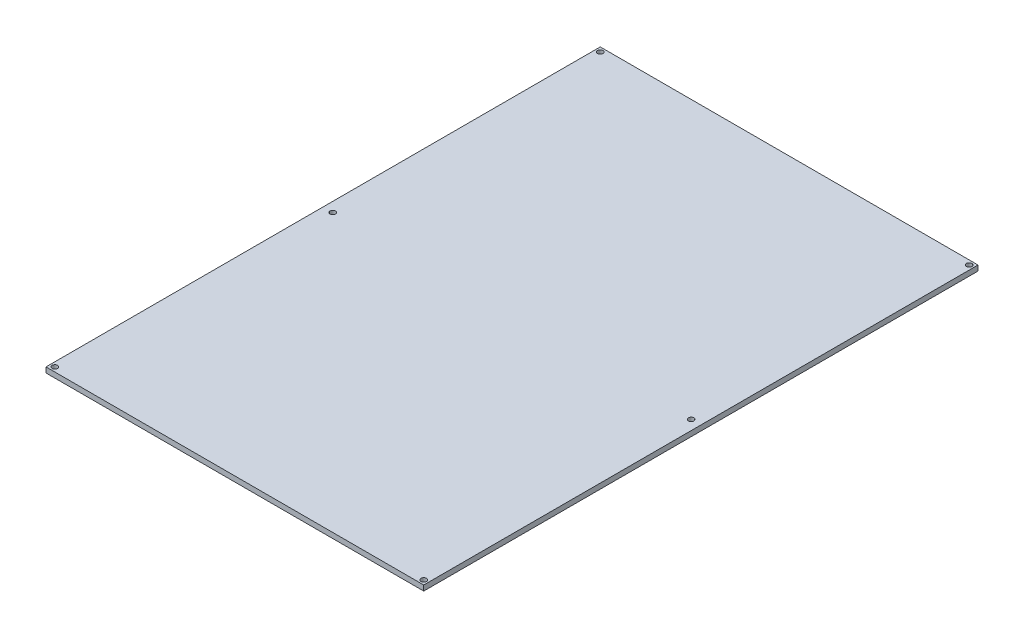
ISO-10303-21;
HEADER;
FILE_DESCRIPTION(('STEP AP214'),'2;1');
FILE_NAME('part.step','',(''),(''),'','','');
FILE_SCHEMA(('AUTOMOTIVE_DESIGN { 1 0 10303 214 1 1 1 1 }'));
ENDSEC;
DATA;
#1=APPLICATION_CONTEXT('core data for automotive mechanical design processes');
#2=APPLICATION_PROTOCOL_DEFINITION('international standard','automotive_design',2000,#1);
#3=PRODUCT_CONTEXT('',#1,'mechanical');
#4=PRODUCT('Part','Part','',(#3));
#5=PRODUCT_RELATED_PRODUCT_CATEGORY('part','',(#4));
#6=PRODUCT_DEFINITION_FORMATION('','',#4);
#7=PRODUCT_DEFINITION_CONTEXT('part definition',#1,'design');
#8=PRODUCT_DEFINITION('design','',#6,#7);
#9=PRODUCT_DEFINITION_SHAPE('','',#8);
#10=(LENGTH_UNIT() NAMED_UNIT(*) SI_UNIT(.MILLI.,.METRE.));
#11=(NAMED_UNIT(*) PLANE_ANGLE_UNIT() SI_UNIT($,.RADIAN.));
#12=(NAMED_UNIT(*) SI_UNIT($,.STERADIAN.) SOLID_ANGLE_UNIT());
#13=UNCERTAINTY_MEASURE_WITH_UNIT(LENGTH_MEASURE(1.E-05),#10,'distance_accuracy_value','');
#14=(GEOMETRIC_REPRESENTATION_CONTEXT(3) GLOBAL_UNCERTAINTY_ASSIGNED_CONTEXT((#13)) GLOBAL_UNIT_ASSIGNED_CONTEXT((#10,
#11,#12)) REPRESENTATION_CONTEXT('',''));
#15=CARTESIAN_POINT('',(0.,0.,0.));
#16=DIRECTION('',(0.,0.,1.));
#17=DIRECTION('',(1.,0.,0.));
#18=AXIS2_PLACEMENT_3D('',#15,#16,#17);
#19=CARTESIAN_POINT('',(0.,3.,0.));
#20=DIRECTION('',(0.,-1.,0.));
#21=DIRECTION('',(0.,0.,-1.));
#22=AXIS2_PLACEMENT_3D('',#19,#20,#21);
#23=PLANE('',#22);
#24=DIRECTION('',(0.,0.,1.));
#25=VECTOR('',#24,1.);
#26=CARTESIAN_POINT('',(0.,3.,0.));
#27=LINE('',#26,#25);
#28=CARTESIAN_POINT('',(-1.11022302462516E-13,3.,-314.));
#29=VERTEX_POINT('',#28);
#30=CARTESIAN_POINT('',(0.,3.,0.));
#31=VERTEX_POINT('',#30);
#32=EDGE_CURVE('E99',#29,#31,#27,.T.);
#33=ORIENTED_EDGE('',*,*,#32,.T.);
#34=DIRECTION('',(1.,0.,0.));
#35=VECTOR('',#34,1.);
#36=CARTESIAN_POINT('',(0.,3.,0.));
#37=LINE('',#36,#35);
#38=CARTESIAN_POINT('',(214.,3.,0.));
#39=VERTEX_POINT('',#38);
#40=EDGE_CURVE('E94',#31,#39,#37,.T.);
#41=ORIENTED_EDGE('',*,*,#40,.T.);
#42=DIRECTION('',(0.,0.,-1.));
#43=VECTOR('',#42,1.);
#44=CARTESIAN_POINT('',(214.,3.,0.));
#45=LINE('',#44,#43);
#46=CARTESIAN_POINT('',(214.,3.,-314.));
#47=VERTEX_POINT('',#46);
#48=EDGE_CURVE('E97',#39,#47,#45,.T.);
#49=ORIENTED_EDGE('',*,*,#48,.T.);
#50=DIRECTION('',(-1.,0.,0.));
#51=VECTOR('',#50,1.);
#52=CARTESIAN_POINT('',(-1.11022302462516E-13,3.,-314.));
#53=LINE('',#52,#51);
#54=EDGE_CURVE('E58',#47,#29,#53,.T.);
#55=ORIENTED_EDGE('',*,*,#54,.T.);
#56=EDGE_LOOP('',(#33,#41,#49,#55));
#57=FACE_BOUND('',#56,.T.);
#58=CARTESIAN_POINT('',(2.5,3.,-311.5));
#59=DIRECTION('',(0.,1.,0.));
#60=DIRECTION('',(0.,0.,1.));
#61=AXIS2_PLACEMENT_3D('',#58,#59,#60);
#62=CIRCLE('',#61,1.55000000000003);
#63=CARTESIAN_POINT('',(2.5,3.,-309.95));
#64=VERTEX_POINT('',#63);
#65=EDGE_CURVE('E121',#64,#64,#62,.T.);
#66=ORIENTED_EDGE('',*,*,#65,.F.);
#67=EDGE_LOOP('',(#66));
#68=FACE_BOUND('',#67,.T.);
#69=CARTESIAN_POINT('',(211.5,3.,-311.5));
#70=DIRECTION('',(0.,1.,0.));
#71=DIRECTION('',(0.,0.,-1.));
#72=AXIS2_PLACEMENT_3D('',#69,#70,#71);
#73=CIRCLE('',#72,1.55);
#74=CARTESIAN_POINT('',(211.5,3.,-313.05));
#75=VERTEX_POINT('',#74);
#76=EDGE_CURVE('E142',#75,#75,#73,.T.);
#77=ORIENTED_EDGE('',*,*,#76,.F.);
#78=EDGE_LOOP('',(#77));
#79=FACE_BOUND('',#78,.T.);
#80=CARTESIAN_POINT('',(2.50000000000009,3.,-2.49999999999998));
#81=DIRECTION('',(0.,1.,0.));
#82=DIRECTION('',(0.,0.,-1.));
#83=AXIS2_PLACEMENT_3D('',#80,#81,#82);
#84=CIRCLE('',#83,1.55000000000001);
#85=CARTESIAN_POINT('',(2.50000000000009,3.,-4.04999999999998));
#86=VERTEX_POINT('',#85);
#87=EDGE_CURVE('E149',#86,#86,#84,.T.);
#88=ORIENTED_EDGE('',*,*,#87,.F.);
#89=EDGE_LOOP('',(#88));
#90=FACE_BOUND('',#89,.T.);
#91=CARTESIAN_POINT('',(211.5,3.,-2.5));
#92=DIRECTION('',(0.,1.,0.));
#93=DIRECTION('',(0.,0.,1.));
#94=AXIS2_PLACEMENT_3D('',#91,#92,#93);
#95=CIRCLE('',#94,1.54999999999999);
#96=CARTESIAN_POINT('',(211.5,3.,-0.950000000000008));
#97=VERTEX_POINT('',#96);
#98=EDGE_CURVE('E156',#97,#97,#95,.T.);
#99=ORIENTED_EDGE('',*,*,#98,.F.);
#100=EDGE_LOOP('',(#99));
#101=FACE_BOUND('',#100,.T.);
#102=CARTESIAN_POINT('',(5.50000000000003,3.,-157.));
#103=DIRECTION('',(0.,1.,0.));
#104=DIRECTION('',(0.,0.,1.));
#105=AXIS2_PLACEMENT_3D('',#102,#103,#104);
#106=CIRCLE('',#105,1.55);
#107=CARTESIAN_POINT('',(5.50000000000003,3.,-155.45));
#108=VERTEX_POINT('',#107);
#109=EDGE_CURVE('E164',#108,#108,#106,.T.);
#110=ORIENTED_EDGE('',*,*,#109,.F.);
#111=EDGE_LOOP('',(#110));
#112=FACE_BOUND('',#111,.T.);
#113=CARTESIAN_POINT('',(208.5,3.,-157.));
#114=DIRECTION('',(0.,1.,0.));
#115=DIRECTION('',(0.,0.,-1.));
#116=AXIS2_PLACEMENT_3D('',#113,#114,#115);
#117=CIRCLE('',#116,1.54999999999999);
#118=CARTESIAN_POINT('',(208.5,3.,-158.55));
#119=VERTEX_POINT('',#118);
#120=EDGE_CURVE('E171',#119,#119,#117,.T.);
#121=ORIENTED_EDGE('',*,*,#120,.F.);
#122=EDGE_LOOP('',(#121));
#123=FACE_BOUND('',#122,.T.);
#124=ADVANCED_FACE('F40',(#57,#68,#79,#90,#101,#112,#123),#23,.F.);
#125=CARTESIAN_POINT('',(0.,0.,0.));
#126=DIRECTION('',(0.,-1.,0.));
#127=DIRECTION('',(0.,0.,-1.));
#128=AXIS2_PLACEMENT_3D('',#125,#126,#127);
#129=PLANE('',#128);
#130=CARTESIAN_POINT('',(5.50000000000003,0.,-157.));
#131=DIRECTION('',(0.,1.,0.));
#132=DIRECTION('',(0.,0.,1.));
#133=AXIS2_PLACEMENT_3D('',#130,#131,#132);
#134=CIRCLE('',#133,1.55);
#135=CARTESIAN_POINT('',(5.50000000000003,0.,-155.45));
#136=VERTEX_POINT('',#135);
#137=EDGE_CURVE('E168',#136,#136,#134,.T.);
#138=ORIENTED_EDGE('',*,*,#137,.T.);
#139=EDGE_LOOP('',(#138));
#140=FACE_BOUND('',#139,.T.);
#141=CARTESIAN_POINT('',(2.50000000000009,0.,-2.49999999999998));
#142=DIRECTION('',(0.,1.,0.));
#143=DIRECTION('',(0.,0.,-1.));
#144=AXIS2_PLACEMENT_3D('',#141,#142,#143);
#145=CIRCLE('',#144,1.55000000000001);
#146=CARTESIAN_POINT('',(2.50000000000009,0.,-4.04999999999998));
#147=VERTEX_POINT('',#146);
#148=EDGE_CURVE('E152',#147,#147,#145,.T.);
#149=ORIENTED_EDGE('',*,*,#148,.T.);
#150=EDGE_LOOP('',(#149));
#151=FACE_BOUND('',#150,.T.);
#152=CARTESIAN_POINT('',(2.5,0.,-311.5));
#153=DIRECTION('',(0.,1.,0.));
#154=DIRECTION('',(0.,0.,1.));
#155=AXIS2_PLACEMENT_3D('',#152,#153,#154);
#156=CIRCLE('',#155,1.55000000000003);
#157=CARTESIAN_POINT('',(2.5,0.,-309.95));
#158=VERTEX_POINT('',#157);
#159=EDGE_CURVE('E139',#158,#158,#156,.T.);
#160=ORIENTED_EDGE('',*,*,#159,.T.);
#161=EDGE_LOOP('',(#160));
#162=FACE_BOUND('',#161,.T.);
#163=DIRECTION('',(0.,0.,1.));
#164=VECTOR('',#163,1.);
#165=CARTESIAN_POINT('',(0.,0.,0.));
#166=LINE('',#165,#164);
#167=CARTESIAN_POINT('',(-1.11022302462516E-13,0.,-314.));
#168=VERTEX_POINT('',#167);
#169=CARTESIAN_POINT('',(0.,0.,0.));
#170=VERTEX_POINT('',#169);
#171=EDGE_CURVE('E117',#168,#170,#166,.T.);
#172=ORIENTED_EDGE('',*,*,#171,.F.);
#173=DIRECTION('',(-1.,0.,0.));
#174=VECTOR('',#173,1.);
#175=CARTESIAN_POINT('',(-1.11022302462516E-13,0.,-314.));
#176=LINE('',#175,#174);
#177=CARTESIAN_POINT('',(214.,0.,-314.));
#178=VERTEX_POINT('',#177);
#179=EDGE_CURVE('E86',#178,#168,#176,.T.);
#180=ORIENTED_EDGE('',*,*,#179,.F.);
#181=DIRECTION('',(0.,0.,-1.));
#182=VECTOR('',#181,1.);
#183=CARTESIAN_POINT('',(214.,0.,0.));
#184=LINE('',#183,#182);
#185=CARTESIAN_POINT('',(214.,0.,0.));
#186=VERTEX_POINT('',#185);
#187=EDGE_CURVE('E80',#186,#178,#184,.T.);
#188=ORIENTED_EDGE('',*,*,#187,.F.);
#189=DIRECTION('',(1.,0.,0.));
#190=VECTOR('',#189,1.);
#191=CARTESIAN_POINT('',(0.,0.,0.));
#192=LINE('',#191,#190);
#193=EDGE_CURVE('E104',#170,#186,#192,.T.);
#194=ORIENTED_EDGE('',*,*,#193,.F.);
#195=EDGE_LOOP('',(#172,#180,#188,#194));
#196=FACE_BOUND('',#195,.T.);
#197=CARTESIAN_POINT('',(211.5,0.,-311.5));
#198=DIRECTION('',(0.,1.,0.));
#199=DIRECTION('',(0.,0.,-1.));
#200=AXIS2_PLACEMENT_3D('',#197,#198,#199);
#201=CIRCLE('',#200,1.55);
#202=CARTESIAN_POINT('',(211.5,0.,-313.05));
#203=VERTEX_POINT('',#202);
#204=EDGE_CURVE('E145',#203,#203,#201,.T.);
#205=ORIENTED_EDGE('',*,*,#204,.T.);
#206=EDGE_LOOP('',(#205));
#207=FACE_BOUND('',#206,.T.);
#208=CARTESIAN_POINT('',(211.5,0.,-2.5));
#209=DIRECTION('',(0.,1.,0.));
#210=DIRECTION('',(0.,0.,1.));
#211=AXIS2_PLACEMENT_3D('',#208,#209,#210);
#212=CIRCLE('',#211,1.54999999999999);
#213=CARTESIAN_POINT('',(211.5,0.,-0.950000000000008));
#214=VERTEX_POINT('',#213);
#215=EDGE_CURVE('E160',#214,#214,#212,.T.);
#216=ORIENTED_EDGE('',*,*,#215,.T.);
#217=EDGE_LOOP('',(#216));
#218=FACE_BOUND('',#217,.T.);
#219=CARTESIAN_POINT('',(208.5,0.,-157.));
#220=DIRECTION('',(0.,1.,0.));
#221=DIRECTION('',(0.,0.,-1.));
#222=AXIS2_PLACEMENT_3D('',#219,#220,#221);
#223=CIRCLE('',#222,1.54999999999999);
#224=CARTESIAN_POINT('',(208.5,0.,-158.55));
#225=VERTEX_POINT('',#224);
#226=EDGE_CURVE('E175',#225,#225,#223,.T.);
#227=ORIENTED_EDGE('',*,*,#226,.T.);
#228=EDGE_LOOP('',(#227));
#229=FACE_BOUND('',#228,.T.);
#230=ADVANCED_FACE('F133',(#140,#151,#162,#196,#207,#218,#229),#129,.T.);
#231=CARTESIAN_POINT('',(0.,3.,0.));
#232=DIRECTION('',(1.,0.,0.));
#233=DIRECTION('',(0.,0.,-1.));
#234=AXIS2_PLACEMENT_3D('',#231,#232,#233);
#235=PLANE('',#234);
#236=ORIENTED_EDGE('',*,*,#171,.T.);
#237=DIRECTION('',(0.,-1.,0.));
#238=VECTOR('',#237,1.);
#239=CARTESIAN_POINT('',(0.,3.,0.));
#240=LINE('',#239,#238);
#241=EDGE_CURVE('E11',#31,#170,#240,.T.);
#242=ORIENTED_EDGE('',*,*,#241,.F.);
#243=ORIENTED_EDGE('',*,*,#32,.F.);
#244=DIRECTION('',(0.,-1.,0.));
#245=VECTOR('',#244,1.);
#246=CARTESIAN_POINT('',(-1.11022302462516E-13,3.,-314.));
#247=LINE('',#246,#245);
#248=EDGE_CURVE('E113',#29,#168,#247,.T.);
#249=ORIENTED_EDGE('',*,*,#248,.T.);
#250=EDGE_LOOP('',(#236,#242,#243,#249));
#251=FACE_BOUND('',#250,.T.);
#252=ADVANCED_FACE('F42',(#251),#235,.F.);
#253=CARTESIAN_POINT('',(0.,3.,0.));
#254=DIRECTION('',(0.,0.,-1.));
#255=DIRECTION('',(-1.,0.,0.));
#256=AXIS2_PLACEMENT_3D('',#253,#254,#255);
#257=PLANE('',#256);
#258=ORIENTED_EDGE('',*,*,#193,.T.);
#259=DIRECTION('',(0.,-1.,0.));
#260=VECTOR('',#259,1.);
#261=CARTESIAN_POINT('',(214.,3.,0.));
#262=LINE('',#261,#260);
#263=EDGE_CURVE('E50',#39,#186,#262,.T.);
#264=ORIENTED_EDGE('',*,*,#263,.F.);
#265=ORIENTED_EDGE('',*,*,#40,.F.);
#266=ORIENTED_EDGE('',*,*,#241,.T.);
#267=EDGE_LOOP('',(#258,#264,#265,#266));
#268=FACE_BOUND('',#267,.T.);
#269=ADVANCED_FACE('F103',(#268),#257,.F.);
#270=CARTESIAN_POINT('',(214.,3.,0.));
#271=DIRECTION('',(-1.,0.,0.));
#272=DIRECTION('',(0.,0.,1.));
#273=AXIS2_PLACEMENT_3D('',#270,#271,#272);
#274=PLANE('',#273);
#275=ORIENTED_EDGE('',*,*,#187,.T.);
#276=DIRECTION('',(0.,-1.,0.));
#277=VECTOR('',#276,1.);
#278=CARTESIAN_POINT('',(214.,3.,-314.));
#279=LINE('',#278,#277);
#280=EDGE_CURVE('E106',#47,#178,#279,.T.);
#281=ORIENTED_EDGE('',*,*,#280,.F.);
#282=ORIENTED_EDGE('',*,*,#48,.F.);
#283=ORIENTED_EDGE('',*,*,#263,.T.);
#284=EDGE_LOOP('',(#275,#281,#282,#283));
#285=FACE_BOUND('',#284,.T.);
#286=ADVANCED_FACE('F107',(#285),#274,.F.);
#287=CARTESIAN_POINT('',(-1.11022302462516E-13,3.,-314.));
#288=DIRECTION('',(0.,0.,1.));
#289=DIRECTION('',(1.,0.,0.));
#290=AXIS2_PLACEMENT_3D('',#287,#288,#289);
#291=PLANE('',#290);
#292=ORIENTED_EDGE('',*,*,#179,.T.);
#293=ORIENTED_EDGE('',*,*,#248,.F.);
#294=ORIENTED_EDGE('',*,*,#54,.F.);
#295=ORIENTED_EDGE('',*,*,#280,.T.);
#296=EDGE_LOOP('',(#292,#293,#294,#295));
#297=FACE_BOUND('',#296,.T.);
#298=ADVANCED_FACE('F130',(#297),#291,.F.);
#299=CARTESIAN_POINT('',(2.5,3.,-311.5));
#300=DIRECTION('',(0.,-1.,0.));
#301=DIRECTION('',(0.,0.,-1.));
#302=AXIS2_PLACEMENT_3D('',#299,#300,#301);
#303=CYLINDRICAL_SURFACE('',#302,1.55000000000003);
#304=ORIENTED_EDGE('',*,*,#65,.T.);
#305=EDGE_LOOP('',(#304));
#306=FACE_BOUND('',#305,.T.);
#307=ORIENTED_EDGE('',*,*,#159,.F.);
#308=EDGE_LOOP('',(#307));
#309=FACE_BOUND('',#308,.T.);
#310=ADVANCED_FACE('F193',(#306,#309),#303,.F.);
#311=CARTESIAN_POINT('',(211.5,3.,-311.5));
#312=DIRECTION('',(0.,-1.,0.));
#313=DIRECTION('',(0.,0.,-1.));
#314=AXIS2_PLACEMENT_3D('',#311,#312,#313);
#315=CYLINDRICAL_SURFACE('',#314,1.55);
#316=ORIENTED_EDGE('',*,*,#76,.T.);
#317=EDGE_LOOP('',(#316));
#318=FACE_BOUND('',#317,.T.);
#319=ORIENTED_EDGE('',*,*,#204,.F.);
#320=EDGE_LOOP('',(#319));
#321=FACE_BOUND('',#320,.T.);
#322=ADVANCED_FACE('F226',(#318,#321),#315,.F.);
#323=CARTESIAN_POINT('',(2.50000000000009,3.,-2.49999999999998));
#324=DIRECTION('',(0.,-1.,0.));
#325=DIRECTION('',(0.,0.,-1.));
#326=AXIS2_PLACEMENT_3D('',#323,#324,#325);
#327=CYLINDRICAL_SURFACE('',#326,1.55000000000001);
#328=ORIENTED_EDGE('',*,*,#87,.T.);
#329=EDGE_LOOP('',(#328));
#330=FACE_BOUND('',#329,.T.);
#331=ORIENTED_EDGE('',*,*,#148,.F.);
#332=EDGE_LOOP('',(#331));
#333=FACE_BOUND('',#332,.T.);
#334=ADVANCED_FACE('F233',(#330,#333),#327,.F.);
#335=CARTESIAN_POINT('',(211.5,3.,-2.5));
#336=DIRECTION('',(0.,-1.,0.));
#337=DIRECTION('',(0.,0.,-1.));
#338=AXIS2_PLACEMENT_3D('',#335,#336,#337);
#339=CYLINDRICAL_SURFACE('',#338,1.54999999999999);
#340=ORIENTED_EDGE('',*,*,#98,.T.);
#341=EDGE_LOOP('',(#340));
#342=FACE_BOUND('',#341,.T.);
#343=ORIENTED_EDGE('',*,*,#215,.F.);
#344=EDGE_LOOP('',(#343));
#345=FACE_BOUND('',#344,.T.);
#346=ADVANCED_FACE('F240',(#342,#345),#339,.F.);
#347=CARTESIAN_POINT('',(5.50000000000003,3.,-157.));
#348=DIRECTION('',(0.,-1.,0.));
#349=DIRECTION('',(0.,0.,-1.));
#350=AXIS2_PLACEMENT_3D('',#347,#348,#349);
#351=CYLINDRICAL_SURFACE('',#350,1.55);
#352=ORIENTED_EDGE('',*,*,#109,.T.);
#353=EDGE_LOOP('',(#352));
#354=FACE_BOUND('',#353,.T.);
#355=ORIENTED_EDGE('',*,*,#137,.F.);
#356=EDGE_LOOP('',(#355));
#357=FACE_BOUND('',#356,.T.);
#358=ADVANCED_FACE('F248',(#354,#357),#351,.F.);
#359=CARTESIAN_POINT('',(208.5,3.,-157.));
#360=DIRECTION('',(0.,-1.,0.));
#361=DIRECTION('',(0.,0.,-1.));
#362=AXIS2_PLACEMENT_3D('',#359,#360,#361);
#363=CYLINDRICAL_SURFACE('',#362,1.54999999999999);
#364=ORIENTED_EDGE('',*,*,#120,.T.);
#365=EDGE_LOOP('',(#364));
#366=FACE_BOUND('',#365,.T.);
#367=ORIENTED_EDGE('',*,*,#226,.F.);
#368=EDGE_LOOP('',(#367));
#369=FACE_BOUND('',#368,.T.);
#370=ADVANCED_FACE('F182',(#366,#369),#363,.F.);
#371=CLOSED_SHELL('',(#124,#230,#252,#269,#286,#298,#310,#322,#334,#346,#358,#370));
#372=MANIFOLD_SOLID_BREP('B2',#371);
#373=ADVANCED_BREP_SHAPE_REPRESENTATION('',(#18,#372),#14);
#374=SHAPE_DEFINITION_REPRESENTATION(#9,#373);
ENDSEC;
END-ISO-10303-21;
